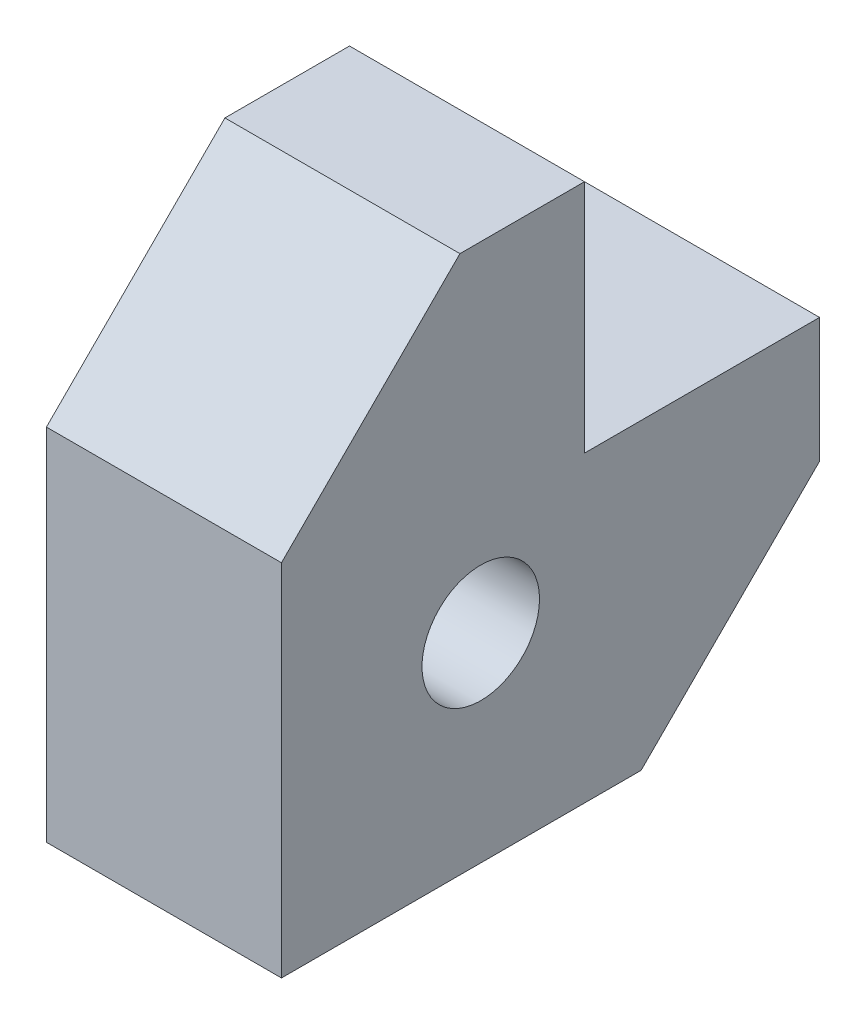
ISO-10303-21;
HEADER;
FILE_DESCRIPTION(('STEP AP214'),'2;1');
FILE_NAME('part.step','',(''),(''),'','','');
FILE_SCHEMA(('AUTOMOTIVE_DESIGN { 1 0 10303 214 1 1 1 1 }'));
ENDSEC;
DATA;
#1=APPLICATION_CONTEXT('core data for automotive mechanical design processes');
#2=APPLICATION_PROTOCOL_DEFINITION('international standard','automotive_design',2000,#1);
#3=PRODUCT_CONTEXT('',#1,'mechanical');
#4=PRODUCT('Part','Part','',(#3));
#5=PRODUCT_RELATED_PRODUCT_CATEGORY('part','',(#4));
#6=PRODUCT_DEFINITION_FORMATION('','',#4);
#7=PRODUCT_DEFINITION_CONTEXT('part definition',#1,'design');
#8=PRODUCT_DEFINITION('design','',#6,#7);
#9=PRODUCT_DEFINITION_SHAPE('','',#8);
#10=(LENGTH_UNIT() NAMED_UNIT(*) SI_UNIT(.MILLI.,.METRE.));
#11=(NAMED_UNIT(*) PLANE_ANGLE_UNIT() SI_UNIT($,.RADIAN.));
#12=(NAMED_UNIT(*) SI_UNIT($,.STERADIAN.) SOLID_ANGLE_UNIT());
#13=UNCERTAINTY_MEASURE_WITH_UNIT(LENGTH_MEASURE(1.E-05),#10,'distance_accuracy_value','');
#14=(GEOMETRIC_REPRESENTATION_CONTEXT(3) GLOBAL_UNCERTAINTY_ASSIGNED_CONTEXT((#13)) GLOBAL_UNIT_ASSIGNED_CONTEXT((#10,
#11,#12)) REPRESENTATION_CONTEXT('',''));
#15=CARTESIAN_POINT('',(0.,0.,0.));
#16=DIRECTION('',(0.,0.,1.));
#17=DIRECTION('',(1.,0.,0.));
#18=AXIS2_PLACEMENT_3D('',#15,#16,#17);
#19=CARTESIAN_POINT('',(20.,0.,0.));
#20=DIRECTION('',(-1.,0.,0.));
#21=DIRECTION('',(0.,0.,1.));
#22=AXIS2_PLACEMENT_3D('',#19,#20,#21);
#23=PLANE('',#22);
#24=DIRECTION('',(0.,0.,1.));
#25=VECTOR('',#24,1.);
#26=CARTESIAN_POINT('',(20.,0.,0.));
#27=LINE('',#26,#25);
#28=CARTESIAN_POINT('',(20.,0.,-20.));
#29=VERTEX_POINT('',#28);
#30=CARTESIAN_POINT('',(20.,0.,0.));
#31=VERTEX_POINT('',#30);
#32=EDGE_CURVE('E151',#29,#31,#27,.T.);
#33=ORIENTED_EDGE('',*,*,#32,.T.);
#34=DIRECTION('',(0.,1.,0.));
#35=VECTOR('',#34,1.);
#36=CARTESIAN_POINT('',(20.,0.,0.));
#37=LINE('',#36,#35);
#38=CARTESIAN_POINT('',(20.,20.,0.));
#39=VERTEX_POINT('',#38);
#40=EDGE_CURVE('E93',#31,#39,#37,.T.);
#41=ORIENTED_EDGE('',*,*,#40,.T.);
#42=DIRECTION('',(0.,0.,1.));
#43=VECTOR('',#42,1.);
#44=CARTESIAN_POINT('',(20.,20.,0.));
#45=LINE('',#44,#43);
#46=CARTESIAN_POINT('',(20.,20.,10.6009887332973));
#47=VERTEX_POINT('',#46);
#48=EDGE_CURVE('E167',#39,#47,#45,.T.);
#49=ORIENTED_EDGE('',*,*,#48,.T.);
#50=DIRECTION('',(0.,-0.707106781186548,0.707106781186547));
#51=VECTOR('',#50,1.);
#52=CARTESIAN_POINT('',(20.,20.,10.6009887332973));
#53=LINE('',#52,#51);
#54=CARTESIAN_POINT('',(20.,4.81327894174157,25.7877097915557));
#55=VERTEX_POINT('',#54);
#56=EDGE_CURVE('E180',#47,#55,#53,.T.);
#57=ORIENTED_EDGE('',*,*,#56,.T.);
#58=DIRECTION('',(0.,-1.,0.));
#59=VECTOR('',#58,1.);
#60=CARTESIAN_POINT('',(20.,4.81327894174157,25.7877097915557));
#61=LINE('',#60,#59);
#62=CARTESIAN_POINT('',(20.,-25.7877097915557,25.7877097915557));
#63=VERTEX_POINT('',#62);
#64=EDGE_CURVE('E112',#55,#63,#61,.T.);
#65=ORIENTED_EDGE('',*,*,#64,.T.);
#66=DIRECTION('',(0.,0.,-1.));
#67=VECTOR('',#66,1.);
#68=CARTESIAN_POINT('',(20.,-25.7877097915557,-4.81327894174157));
#69=LINE('',#68,#67);
#70=CARTESIAN_POINT('',(20.,-25.7877097915557,-4.81327894174157));
#71=VERTEX_POINT('',#70);
#72=EDGE_CURVE('E106',#63,#71,#69,.T.);
#73=ORIENTED_EDGE('',*,*,#72,.T.);
#74=DIRECTION('',(0.,0.70710678118655,-0.707106781186545));
#75=VECTOR('',#74,1.);
#76=CARTESIAN_POINT('',(20.,-10.6009887332971,-20.0000000000001));
#77=LINE('',#76,#75);
#78=CARTESIAN_POINT('',(20.,-10.6009887332971,-20.0000000000001));
#79=VERTEX_POINT('',#78);
#80=EDGE_CURVE('E110',#71,#79,#77,.T.);
#81=ORIENTED_EDGE('',*,*,#80,.T.);
#82=DIRECTION('',(0.,1.,0.));
#83=VECTOR('',#82,1.);
#84=CARTESIAN_POINT('',(20.,0.,-20.));
#85=LINE('',#84,#83);
#86=EDGE_CURVE('E50',#79,#29,#85,.T.);
#87=ORIENTED_EDGE('',*,*,#86,.T.);
#88=EDGE_LOOP('',(#33,#41,#49,#57,#65,#73,#81,#87));
#89=FACE_BOUND('',#88,.T.);
#90=CARTESIAN_POINT('',(20.,-8.83007243034571,8.83007243034571));
#91=DIRECTION('',(1.,0.,0.));
#92=DIRECTION('',(0.,0.,-1.));
#93=AXIS2_PLACEMENT_3D('',#90,#91,#92);
#94=CIRCLE('',#93,5.);
#95=CARTESIAN_POINT('',(20.,-8.83007243034571,3.83007243034571));
#96=VERTEX_POINT('',#95);
#97=EDGE_CURVE('E138',#96,#96,#94,.T.);
#98=ORIENTED_EDGE('',*,*,#97,.F.);
#99=EDGE_LOOP('',(#98));
#100=FACE_BOUND('',#99,.T.);
#101=ADVANCED_FACE('F32',(#89,#100),#23,.F.);
#102=CARTESIAN_POINT('',(0.,0.,0.));
#103=DIRECTION('',(-1.,0.,0.));
#104=DIRECTION('',(0.,0.,1.));
#105=AXIS2_PLACEMENT_3D('',#102,#103,#104);
#106=PLANE('',#105);
#107=DIRECTION('',(0.,0.,1.));
#108=VECTOR('',#107,1.);
#109=CARTESIAN_POINT('',(0.,0.,0.));
#110=LINE('',#109,#108);
#111=CARTESIAN_POINT('',(0.,0.,-20.));
#112=VERTEX_POINT('',#111);
#113=CARTESIAN_POINT('',(0.,0.,0.));
#114=VERTEX_POINT('',#113);
#115=EDGE_CURVE('E134',#112,#114,#110,.T.);
#116=ORIENTED_EDGE('',*,*,#115,.F.);
#117=DIRECTION('',(0.,1.,0.));
#118=VECTOR('',#117,1.);
#119=CARTESIAN_POINT('',(0.,0.,-20.));
#120=LINE('',#119,#118);
#121=CARTESIAN_POINT('',(0.,-10.6009887332971,-20.0000000000001));
#122=VERTEX_POINT('',#121);
#123=EDGE_CURVE('E85',#122,#112,#120,.T.);
#124=ORIENTED_EDGE('',*,*,#123,.F.);
#125=DIRECTION('',(0.,0.70710678118655,-0.707106781186545));
#126=VECTOR('',#125,1.);
#127=CARTESIAN_POINT('',(0.,-10.6009887332971,-20.0000000000001));
#128=LINE('',#127,#126);
#129=CARTESIAN_POINT('',(0.,-25.7877097915557,-4.81327894174157));
#130=VERTEX_POINT('',#129);
#131=EDGE_CURVE('E79',#130,#122,#128,.T.);
#132=ORIENTED_EDGE('',*,*,#131,.F.);
#133=DIRECTION('',(0.,0.,-1.));
#134=VECTOR('',#133,1.);
#135=CARTESIAN_POINT('',(0.,-25.7877097915557,-4.81327894174157));
#136=LINE('',#135,#134);
#137=CARTESIAN_POINT('',(0.,-25.7877097915557,25.7877097915557));
#138=VERTEX_POINT('',#137);
#139=EDGE_CURVE('E121',#138,#130,#136,.T.);
#140=ORIENTED_EDGE('',*,*,#139,.F.);
#141=DIRECTION('',(0.,-1.,0.));
#142=VECTOR('',#141,1.);
#143=CARTESIAN_POINT('',(0.,4.81327894174157,25.7877097915557));
#144=LINE('',#143,#142);
#145=CARTESIAN_POINT('',(0.,4.81327894174157,25.7877097915557));
#146=VERTEX_POINT('',#145);
#147=EDGE_CURVE('E144',#146,#138,#144,.T.);
#148=ORIENTED_EDGE('',*,*,#147,.F.);
#149=DIRECTION('',(0.,-0.707106781186548,0.707106781186547));
#150=VECTOR('',#149,1.);
#151=CARTESIAN_POINT('',(0.,20.,10.6009887332973));
#152=LINE('',#151,#150);
#153=CARTESIAN_POINT('',(0.,20.,10.6009887332973));
#154=VERTEX_POINT('',#153);
#155=EDGE_CURVE('E142',#154,#146,#152,.T.);
#156=ORIENTED_EDGE('',*,*,#155,.F.);
#157=DIRECTION('',(0.,0.,1.));
#158=VECTOR('',#157,1.);
#159=CARTESIAN_POINT('',(0.,20.,0.));
#160=LINE('',#159,#158);
#161=CARTESIAN_POINT('',(0.,20.,0.));
#162=VERTEX_POINT('',#161);
#163=EDGE_CURVE('E140',#162,#154,#160,.T.);
#164=ORIENTED_EDGE('',*,*,#163,.F.);
#165=DIRECTION('',(0.,1.,0.));
#166=VECTOR('',#165,1.);
#167=CARTESIAN_POINT('',(0.,0.,0.));
#168=LINE('',#167,#166);
#169=EDGE_CURVE('E137',#114,#162,#168,.T.);
#170=ORIENTED_EDGE('',*,*,#169,.F.);
#171=EDGE_LOOP('',(#116,#124,#132,#140,#148,#156,#164,#170));
#172=FACE_BOUND('',#171,.T.);
#173=CARTESIAN_POINT('',(0.,-8.83007243034571,8.83007243034571));
#174=DIRECTION('',(1.,0.,0.));
#175=DIRECTION('',(0.,0.,-1.));
#176=AXIS2_PLACEMENT_3D('',#173,#174,#175);
#177=CIRCLE('',#176,5.);
#178=CARTESIAN_POINT('',(0.,-8.83007243034571,3.83007243034571));
#179=VERTEX_POINT('',#178);
#180=EDGE_CURVE('E186',#179,#179,#177,.T.);
#181=ORIENTED_EDGE('',*,*,#180,.T.);
#182=EDGE_LOOP('',(#181));
#183=FACE_BOUND('',#182,.T.);
#184=ADVANCED_FACE('F171',(#172,#183),#106,.T.);
#185=CARTESIAN_POINT('',(20.,0.,0.));
#186=DIRECTION('',(0.,-1.,0.));
#187=DIRECTION('',(0.,0.,-1.));
#188=AXIS2_PLACEMENT_3D('',#185,#186,#187);
#189=PLANE('',#188);
#190=ORIENTED_EDGE('',*,*,#115,.T.);
#191=DIRECTION('',(-1.,0.,0.));
#192=VECTOR('',#191,1.);
#193=CARTESIAN_POINT('',(20.,0.,0.));
#194=LINE('',#193,#192);
#195=EDGE_CURVE('E11',#31,#114,#194,.T.);
#196=ORIENTED_EDGE('',*,*,#195,.F.);
#197=ORIENTED_EDGE('',*,*,#32,.F.);
#198=DIRECTION('',(-1.,0.,0.));
#199=VECTOR('',#198,1.);
#200=CARTESIAN_POINT('',(20.,0.,-20.));
#201=LINE('',#200,#199);
#202=EDGE_CURVE('E130',#29,#112,#201,.T.);
#203=ORIENTED_EDGE('',*,*,#202,.T.);
#204=EDGE_LOOP('',(#190,#196,#197,#203));
#205=FACE_BOUND('',#204,.T.);
#206=ADVANCED_FACE('F34',(#205),#189,.F.);
#207=CARTESIAN_POINT('',(20.,0.,0.));
#208=DIRECTION('',(0.,0.,1.));
#209=DIRECTION('',(1.,0.,0.));
#210=AXIS2_PLACEMENT_3D('',#207,#208,#209);
#211=PLANE('',#210);
#212=ORIENTED_EDGE('',*,*,#169,.T.);
#213=DIRECTION('',(-1.,0.,0.));
#214=VECTOR('',#213,1.);
#215=CARTESIAN_POINT('',(20.,20.,0.));
#216=LINE('',#215,#214);
#217=EDGE_CURVE('E42',#39,#162,#216,.T.);
#218=ORIENTED_EDGE('',*,*,#217,.F.);
#219=ORIENTED_EDGE('',*,*,#40,.F.);
#220=ORIENTED_EDGE('',*,*,#195,.T.);
#221=EDGE_LOOP('',(#212,#218,#219,#220));
#222=FACE_BOUND('',#221,.T.);
#223=ADVANCED_FACE('F214',(#222),#211,.F.);
#224=CARTESIAN_POINT('',(20.,20.,0.));
#225=DIRECTION('',(0.,-1.,0.));
#226=DIRECTION('',(0.,0.,-1.));
#227=AXIS2_PLACEMENT_3D('',#224,#225,#226);
#228=PLANE('',#227);
#229=ORIENTED_EDGE('',*,*,#163,.T.);
#230=DIRECTION('',(-1.,0.,0.));
#231=VECTOR('',#230,1.);
#232=CARTESIAN_POINT('',(20.,20.,10.6009887332973));
#233=LINE('',#232,#231);
#234=EDGE_CURVE('E159',#47,#154,#233,.T.);
#235=ORIENTED_EDGE('',*,*,#234,.F.);
#236=ORIENTED_EDGE('',*,*,#48,.F.);
#237=ORIENTED_EDGE('',*,*,#217,.T.);
#238=EDGE_LOOP('',(#229,#235,#236,#237));
#239=FACE_BOUND('',#238,.T.);
#240=ADVANCED_FACE('F165',(#239),#228,.F.);
#241=CARTESIAN_POINT('',(20.,20.,10.6009887332973));
#242=DIRECTION('',(0.,-0.707106781186547,-0.707106781186548));
#243=DIRECTION('',(0.,0.707106781186548,-0.707106781186547));
#244=AXIS2_PLACEMENT_3D('',#241,#242,#243);
#245=PLANE('',#244);
#246=ORIENTED_EDGE('',*,*,#155,.T.);
#247=DIRECTION('',(-1.,0.,0.));
#248=VECTOR('',#247,1.);
#249=CARTESIAN_POINT('',(20.,4.81327894174157,25.7877097915557));
#250=LINE('',#249,#248);
#251=EDGE_CURVE('E156',#55,#146,#250,.T.);
#252=ORIENTED_EDGE('',*,*,#251,.F.);
#253=ORIENTED_EDGE('',*,*,#56,.F.);
#254=ORIENTED_EDGE('',*,*,#234,.T.);
#255=EDGE_LOOP('',(#246,#252,#253,#254));
#256=FACE_BOUND('',#255,.T.);
#257=ADVANCED_FACE('F176',(#256),#245,.F.);
#258=CARTESIAN_POINT('',(20.,4.81327894174157,25.7877097915557));
#259=DIRECTION('',(0.,0.,-1.));
#260=DIRECTION('',(0.,1.,0.));
#261=AXIS2_PLACEMENT_3D('',#258,#259,#260);
#262=PLANE('',#261);
#263=ORIENTED_EDGE('',*,*,#147,.T.);
#264=DIRECTION('',(-1.,0.,0.));
#265=VECTOR('',#264,1.);
#266=CARTESIAN_POINT('',(20.,-25.7877097915557,25.7877097915557));
#267=LINE('',#266,#265);
#268=EDGE_CURVE('E123',#63,#138,#267,.T.);
#269=ORIENTED_EDGE('',*,*,#268,.F.);
#270=ORIENTED_EDGE('',*,*,#64,.F.);
#271=ORIENTED_EDGE('',*,*,#251,.T.);
#272=EDGE_LOOP('',(#263,#269,#270,#271));
#273=FACE_BOUND('',#272,.T.);
#274=ADVANCED_FACE('F179',(#273),#262,.F.);
#275=CARTESIAN_POINT('',(20.,-25.7877097915557,-4.81327894174157));
#276=DIRECTION('',(0.,1.,0.));
#277=DIRECTION('',(0.,0.,1.));
#278=AXIS2_PLACEMENT_3D('',#275,#276,#277);
#279=PLANE('',#278);
#280=ORIENTED_EDGE('',*,*,#139,.T.);
#281=DIRECTION('',(-1.,0.,0.));
#282=VECTOR('',#281,1.);
#283=CARTESIAN_POINT('',(20.,-25.7877097915557,-4.81327894174157));
#284=LINE('',#283,#282);
#285=EDGE_CURVE('E118',#71,#130,#284,.T.);
#286=ORIENTED_EDGE('',*,*,#285,.F.);
#287=ORIENTED_EDGE('',*,*,#72,.F.);
#288=ORIENTED_EDGE('',*,*,#268,.T.);
#289=EDGE_LOOP('',(#280,#286,#287,#288));
#290=FACE_BOUND('',#289,.T.);
#291=ADVANCED_FACE('F119',(#290),#279,.F.);
#292=CARTESIAN_POINT('',(20.,-10.6009887332971,-20.0000000000001));
#293=DIRECTION('',(0.,0.707106781186545,0.70710678118655));
#294=DIRECTION('',(0.,-0.70710678118655,0.707106781186545));
#295=AXIS2_PLACEMENT_3D('',#292,#293,#294);
#296=PLANE('',#295);
#297=ORIENTED_EDGE('',*,*,#131,.T.);
#298=DIRECTION('',(-1.,0.,0.));
#299=VECTOR('',#298,1.);
#300=CARTESIAN_POINT('',(20.,-10.6009887332971,-20.0000000000001));
#301=LINE('',#300,#299);
#302=EDGE_CURVE('E124',#79,#122,#301,.T.);
#303=ORIENTED_EDGE('',*,*,#302,.F.);
#304=ORIENTED_EDGE('',*,*,#80,.F.);
#305=ORIENTED_EDGE('',*,*,#285,.T.);
#306=EDGE_LOOP('',(#297,#303,#304,#305));
#307=FACE_BOUND('',#306,.T.);
#308=ADVANCED_FACE('F126',(#307),#296,.F.);
#309=CARTESIAN_POINT('',(20.,0.,-20.));
#310=DIRECTION('',(0.,0.,1.));
#311=DIRECTION('',(0.,-1.,0.));
#312=AXIS2_PLACEMENT_3D('',#309,#310,#311);
#313=PLANE('',#312);
#314=ORIENTED_EDGE('',*,*,#123,.T.);
#315=ORIENTED_EDGE('',*,*,#202,.F.);
#316=ORIENTED_EDGE('',*,*,#86,.F.);
#317=ORIENTED_EDGE('',*,*,#302,.T.);
#318=EDGE_LOOP('',(#314,#315,#316,#317));
#319=FACE_BOUND('',#318,.T.);
#320=ADVANCED_FACE('F202',(#319),#313,.F.);
#321=CARTESIAN_POINT('',(20.,-8.83007243034571,8.83007243034571));
#322=DIRECTION('',(-1.,0.,0.));
#323=DIRECTION('',(0.,0.,1.));
#324=AXIS2_PLACEMENT_3D('',#321,#322,#323);
#325=CYLINDRICAL_SURFACE('',#324,5.);
#326=ORIENTED_EDGE('',*,*,#97,.T.);
#327=EDGE_LOOP('',(#326));
#328=FACE_BOUND('',#327,.T.);
#329=ORIENTED_EDGE('',*,*,#180,.F.);
#330=EDGE_LOOP('',(#329));
#331=FACE_BOUND('',#330,.T.);
#332=ADVANCED_FACE('F192',(#328,#331),#325,.F.);
#333=CLOSED_SHELL('',(#101,#184,#206,#223,#240,#257,#274,#291,#308,#320,#332));
#334=MANIFOLD_SOLID_BREP('B2',#333);
#335=ADVANCED_BREP_SHAPE_REPRESENTATION('',(#18,#334),#14);
#336=SHAPE_DEFINITION_REPRESENTATION(#9,#335);
ENDSEC;
END-ISO-10303-21;
